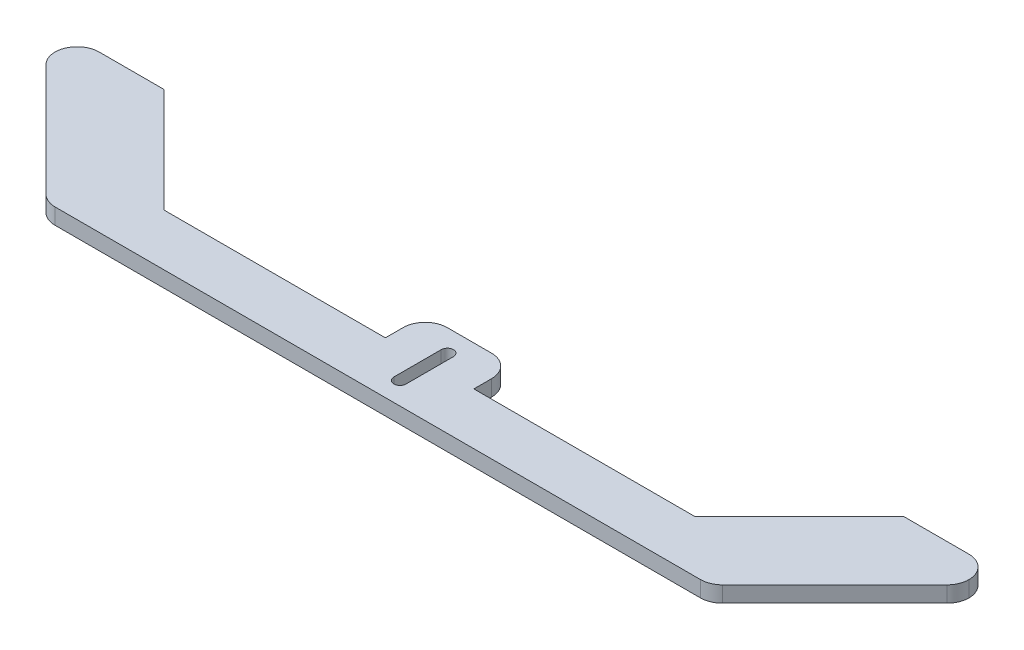
ISO-10303-21;
HEADER;
FILE_DESCRIPTION(('STEP AP214'),'2;1');
FILE_NAME('part.step','',(''),(''),'','','');
FILE_SCHEMA(('AUTOMOTIVE_DESIGN { 1 0 10303 214 1 1 1 1 }'));
ENDSEC;
DATA;
#1=APPLICATION_CONTEXT('core data for automotive mechanical design processes');
#2=APPLICATION_PROTOCOL_DEFINITION('international standard','automotive_design',2000,#1);
#3=PRODUCT_CONTEXT('',#1,'mechanical');
#4=PRODUCT('Part','Part','',(#3));
#5=PRODUCT_RELATED_PRODUCT_CATEGORY('part','',(#4));
#6=PRODUCT_DEFINITION_FORMATION('','',#4);
#7=PRODUCT_DEFINITION_CONTEXT('part definition',#1,'design');
#8=PRODUCT_DEFINITION('design','',#6,#7);
#9=PRODUCT_DEFINITION_SHAPE('','',#8);
#10=(LENGTH_UNIT() NAMED_UNIT(*) SI_UNIT(.MILLI.,.METRE.));
#11=(NAMED_UNIT(*) PLANE_ANGLE_UNIT() SI_UNIT($,.RADIAN.));
#12=(NAMED_UNIT(*) SI_UNIT($,.STERADIAN.) SOLID_ANGLE_UNIT());
#13=UNCERTAINTY_MEASURE_WITH_UNIT(LENGTH_MEASURE(1.E-05),#10,'distance_accuracy_value','');
#14=(GEOMETRIC_REPRESENTATION_CONTEXT(3) GLOBAL_UNCERTAINTY_ASSIGNED_CONTEXT((#13)) GLOBAL_UNIT_ASSIGNED_CONTEXT((#10,
#11,#12)) REPRESENTATION_CONTEXT('',''));
#15=CARTESIAN_POINT('',(0.,0.,0.));
#16=DIRECTION('',(0.,0.,1.));
#17=DIRECTION('',(1.,0.,0.));
#18=AXIS2_PLACEMENT_3D('',#15,#16,#17);
#19=CARTESIAN_POINT('',(0.,4.572,0.));
#20=DIRECTION('',(0.,-1.,0.));
#21=DIRECTION('',(0.,0.,-1.));
#22=AXIS2_PLACEMENT_3D('',#19,#20,#21);
#23=PLANE('',#22);
#24=DIRECTION('',(0.,0.,-1.));
#25=VECTOR('',#24,1.);
#26=CARTESIAN_POINT('',(15.4,4.572,-12.4016541141747));
#27=LINE('',#26,#25);
#28=CARTESIAN_POINT('',(15.4,4.572,-0.971654114174717));
#29=VERTEX_POINT('',#28);
#30=CARTESIAN_POINT('',(15.4,4.572,-6.05165411417471));
#31=VERTEX_POINT('',#30);
#32=EDGE_CURVE('E253',#29,#31,#27,.T.);
#33=ORIENTED_EDGE('',*,*,#32,.T.);
#34=CARTESIAN_POINT('',(9.05,4.572,-6.05165411417472));
#35=DIRECTION('',(0.,-1.,0.));
#36=DIRECTION('',(0.,0.,-1.));
#37=AXIS2_PLACEMENT_3D('',#34,#35,#36);
#38=CIRCLE('',#37,6.35);
#39=CARTESIAN_POINT('',(9.05,4.572,-12.4016541141747));
#40=VERTEX_POINT('',#39);
#41=EDGE_CURVE('E41',#31,#40,#38,.F.);
#42=ORIENTED_EDGE('',*,*,#41,.T.);
#43=DIRECTION('',(-1.,0.,0.));
#44=VECTOR('',#43,1.);
#45=CARTESIAN_POINT('',(15.4,4.572,-12.4016541141747));
#46=LINE('',#45,#44);
#47=CARTESIAN_POINT('',(-3.64999999999999,4.572,-12.4016541141747));
#48=VERTEX_POINT('',#47);
#49=EDGE_CURVE('E255',#40,#48,#46,.T.);
#50=ORIENTED_EDGE('',*,*,#49,.T.);
#51=CARTESIAN_POINT('',(-3.65,4.572,-6.05165411417472));
#52=DIRECTION('',(0.,-1.,0.));
#53=DIRECTION('',(0.,0.,-1.));
#54=AXIS2_PLACEMENT_3D('',#51,#52,#53);
#55=CIRCLE('',#54,6.35);
#56=CARTESIAN_POINT('',(-9.99999999999999,4.572,-6.05165411417472));
#57=VERTEX_POINT('',#56);
#58=EDGE_CURVE('E48',#48,#57,#55,.F.);
#59=ORIENTED_EDGE('',*,*,#58,.T.);
#60=DIRECTION('',(0.,0.,1.));
#61=VECTOR('',#60,1.);
#62=CARTESIAN_POINT('',(-9.99999999999999,4.572,-12.4016541141747));
#63=LINE('',#62,#61);
#64=CARTESIAN_POINT('',(-9.99999999999999,4.572,-0.971654114174714));
#65=VERTEX_POINT('',#64);
#66=EDGE_CURVE('E257',#57,#65,#63,.T.);
#67=ORIENTED_EDGE('',*,*,#66,.T.);
#68=DIRECTION('',(-1.,0.,0.));
#69=VECTOR('',#68,1.);
#70=CARTESIAN_POINT('',(-9.99999999999999,4.572,-0.971654114174714));
#71=LINE('',#70,#69);
#72=CARTESIAN_POINT('',(-73.5,4.572,-0.971654114174706));
#73=VERTEX_POINT('',#72);
#74=EDGE_CURVE('E259',#65,#73,#71,.T.);
#75=ORIENTED_EDGE('',*,*,#74,.T.);
#76=DIRECTION('',(-0.707106781186547,0.,-0.707106781186547));
#77=VECTOR('',#76,1.);
#78=CARTESIAN_POINT('',(-73.5,4.572,-0.971654114174706));
#79=LINE('',#78,#77);
#80=CARTESIAN_POINT('',(-103.478135759685,4.572,-30.94978987386));
#81=VERTEX_POINT('',#80);
#82=EDGE_CURVE('E261',#73,#81,#79,.T.);
#83=ORIENTED_EDGE('',*,*,#82,.T.);
#84=DIRECTION('',(-1.,0.,0.));
#85=VECTOR('',#84,1.);
#86=CARTESIAN_POINT('',(-103.478135759685,4.572,-30.94978987386));
#87=LINE('',#86,#85);
#88=CARTESIAN_POINT('',(-122.121024484277,4.572,-30.94978987386));
#89=VERTEX_POINT('',#88);
#90=EDGE_CURVE('E263',#81,#89,#87,.T.);
#91=ORIENTED_EDGE('',*,*,#90,.T.);
#92=CARTESIAN_POINT('',(-122.121024484277,4.572,-24.59978987386));
#93=DIRECTION('',(0.,-1.,0.));
#94=DIRECTION('',(0.,0.,-1.));
#95=AXIS2_PLACEMENT_3D('',#92,#93,#94);
#96=CIRCLE('',#95,6.35);
#97=CARTESIAN_POINT('',(-128.470968886108,4.572,-24.6263622966902));
#98=VERTEX_POINT('',#97);
#99=EDGE_CURVE('E339',#89,#98,#96,.F.);
#100=ORIENTED_EDGE('',*,*,#99,.T.);
#101=CARTESIAN_POINT('',(-122.121024484277,4.572,-24.6529347195205));
#102=DIRECTION('',(0.,-1.,0.));
#103=DIRECTION('',(0.,0.,-1.));
#104=AXIS2_PLACEMENT_3D('',#101,#102,#103);
#105=CIRCLE('',#104,6.35);
#106=CARTESIAN_POINT('',(-126.611152544811,4.572,-20.1628066589859));
#107=VERTEX_POINT('',#106);
#108=EDGE_CURVE('E337',#98,#107,#105,.F.);
#109=ORIENTED_EDGE('',*,*,#108,.T.);
#110=DIRECTION('',(0.707106781186548,0.,0.707106781186547));
#111=VECTOR('',#110,1.);
#112=CARTESIAN_POINT('',(-92.55,4.572,13.8983458858253));
#113=LINE('',#112,#111);
#114=CARTESIAN_POINT('',(-94.4098719394654,4.572,12.0384739463599));
#115=VERTEX_POINT('',#114);
#116=EDGE_CURVE('E266',#107,#115,#113,.T.);
#117=ORIENTED_EDGE('',*,*,#116,.T.);
#118=CARTESIAN_POINT('',(-89.9197438789308,4.572,7.54834588582531));
#119=DIRECTION('',(0.,-1.,0.));
#120=DIRECTION('',(0.,0.,-1.));
#121=AXIS2_PLACEMENT_3D('',#118,#119,#120);
#122=CIRCLE('',#121,6.35);
#123=CARTESIAN_POINT('',(-89.9197438789308,4.572,13.8983458858253));
#124=VERTEX_POINT('',#123);
#125=EDGE_CURVE('E329',#115,#124,#122,.F.);
#126=ORIENTED_EDGE('',*,*,#125,.T.);
#127=DIRECTION('',(1.,0.,0.));
#128=VECTOR('',#127,1.);
#129=CARTESIAN_POINT('',(15.4,4.572,13.8983458858253));
#130=LINE('',#129,#128);
#131=CARTESIAN_POINT('',(95.3197438789309,4.572,13.8983458858253));
#132=VERTEX_POINT('',#131);
#133=EDGE_CURVE('E240',#124,#132,#130,.T.);
#134=ORIENTED_EDGE('',*,*,#133,.T.);
#135=CARTESIAN_POINT('',(95.3197438789309,4.572,7.54834588582525));
#136=DIRECTION('',(0.,-1.,0.));
#137=DIRECTION('',(0.,0.,-1.));
#138=AXIS2_PLACEMENT_3D('',#135,#136,#137);
#139=CIRCLE('',#138,6.35);
#140=CARTESIAN_POINT('',(99.8098719394654,4.572,12.0384739463598));
#141=VERTEX_POINT('',#140);
#142=EDGE_CURVE('E331',#132,#141,#139,.F.);
#143=ORIENTED_EDGE('',*,*,#142,.T.);
#144=DIRECTION('',(0.707106781186548,0.,-0.707106781186547));
#145=VECTOR('',#144,1.);
#146=CARTESIAN_POINT('',(97.95,4.572,13.8983458858253));
#147=LINE('',#146,#145);
#148=CARTESIAN_POINT('',(132.011152544811,4.572,-20.1628066589859));
#149=VERTEX_POINT('',#148);
#150=EDGE_CURVE('E243',#141,#149,#147,.T.);
#151=ORIENTED_EDGE('',*,*,#150,.T.);
#152=CARTESIAN_POINT('',(127.521024484277,4.572,-24.6529347195205));
#153=DIRECTION('',(0.,-1.,0.));
#154=DIRECTION('',(0.,0.,-1.));
#155=AXIS2_PLACEMENT_3D('',#152,#153,#154);
#156=CIRCLE('',#155,6.35);
#157=CARTESIAN_POINT('',(133.870968886108,4.572,-24.6263622966903));
#158=VERTEX_POINT('',#157);
#159=EDGE_CURVE('E333',#149,#158,#156,.F.);
#160=ORIENTED_EDGE('',*,*,#159,.T.);
#161=CARTESIAN_POINT('',(127.521024484277,4.572,-24.59978987386));
#162=DIRECTION('',(0.,-1.,0.));
#163=DIRECTION('',(0.,0.,-1.));
#164=AXIS2_PLACEMENT_3D('',#161,#162,#163);
#165=CIRCLE('',#164,6.35);
#166=CARTESIAN_POINT('',(127.521024484277,4.572,-30.94978987386));
#167=VERTEX_POINT('',#166);
#168=EDGE_CURVE('E335',#158,#167,#165,.F.);
#169=ORIENTED_EDGE('',*,*,#168,.T.);
#170=DIRECTION('',(-1.,0.,0.));
#171=VECTOR('',#170,1.);
#172=CARTESIAN_POINT('',(108.878135759685,4.572,-30.94978987386));
#173=LINE('',#172,#171);
#174=CARTESIAN_POINT('',(108.878135759685,4.572,-30.94978987386));
#175=VERTEX_POINT('',#174);
#176=EDGE_CURVE('E247',#167,#175,#173,.T.);
#177=ORIENTED_EDGE('',*,*,#176,.T.);
#178=DIRECTION('',(-0.707106781186547,0.,0.707106781186548));
#179=VECTOR('',#178,1.);
#180=CARTESIAN_POINT('',(78.9,4.572,-0.971654114174717));
#181=LINE('',#180,#179);
#182=CARTESIAN_POINT('',(78.9,4.572,-0.971654114174717));
#183=VERTEX_POINT('',#182);
#184=EDGE_CURVE('E249',#175,#183,#181,.T.);
#185=ORIENTED_EDGE('',*,*,#184,.T.);
#186=DIRECTION('',(-1.,0.,0.));
#187=VECTOR('',#186,1.);
#188=CARTESIAN_POINT('',(15.4,4.572,-0.971654114174717));
#189=LINE('',#188,#187);
#190=EDGE_CURVE('E251',#183,#29,#189,.T.);
#191=ORIENTED_EDGE('',*,*,#190,.T.);
#192=EDGE_LOOP('',(#33,#42,#50,#59,#67,#75,#83,#91,#100,#109,#117,#126,#134,#143,#151,#160,#169,
#177,#185,#191));
#193=FACE_BOUND('',#192,.T.);
#194=CARTESIAN_POINT('',(2.7,4.572,7.54834588582528));
#195=DIRECTION('',(0.,1.,0.));
#196=DIRECTION('',(0.,0.,1.));
#197=AXIS2_PLACEMENT_3D('',#194,#195,#196);
#198=CIRCLE('',#197,1.75);
#199=CARTESIAN_POINT('',(0.949999999999996,4.572,7.54834588582528));
#200=VERTEX_POINT('',#199);
#201=CARTESIAN_POINT('',(4.45,4.572,7.54834588582528));
#202=VERTEX_POINT('',#201);
#203=EDGE_CURVE('E198',#200,#202,#198,.T.);
#204=ORIENTED_EDGE('',*,*,#203,.F.);
#205=DIRECTION('',(0.,0.,1.));
#206=VECTOR('',#205,1.);
#207=CARTESIAN_POINT('',(0.949999999999996,4.572,7.54834588582528));
#208=LINE('',#207,#206);
#209=CARTESIAN_POINT('',(0.949999999999995,4.572,-6.05165411417472));
#210=VERTEX_POINT('',#209);
#211=EDGE_CURVE('E223',#210,#200,#208,.T.);
#212=ORIENTED_EDGE('',*,*,#211,.F.);
#213=CARTESIAN_POINT('',(2.70000000000001,4.572,-6.05165411417472));
#214=DIRECTION('',(0.,1.,0.));
#215=DIRECTION('',(0.,0.,1.));
#216=AXIS2_PLACEMENT_3D('',#213,#214,#215);
#217=CIRCLE('',#216,1.75);
#218=CARTESIAN_POINT('',(4.45000000000001,4.572,-6.05165411417472));
#219=VERTEX_POINT('',#218);
#220=EDGE_CURVE('E221',#219,#210,#217,.T.);
#221=ORIENTED_EDGE('',*,*,#220,.F.);
#222=DIRECTION('',(0.,0.,-1.));
#223=VECTOR('',#222,1.);
#224=CARTESIAN_POINT('',(4.45,4.572,7.54834588582528));
#225=LINE('',#224,#223);
#226=EDGE_CURVE('E208',#202,#219,#225,.T.);
#227=ORIENTED_EDGE('',*,*,#226,.F.);
#228=EDGE_LOOP('',(#204,#212,#221,#227));
#229=FACE_BOUND('',#228,.T.);
#230=ADVANCED_FACE('F33',(#193,#229),#23,.F.);
#231=CARTESIAN_POINT('',(0.,0.,0.));
#232=DIRECTION('',(0.,-1.,0.));
#233=DIRECTION('',(0.,0.,-1.));
#234=AXIS2_PLACEMENT_3D('',#231,#232,#233);
#235=PLANE('',#234);
#236=DIRECTION('',(-1.,0.,0.));
#237=VECTOR('',#236,1.);
#238=CARTESIAN_POINT('',(15.4,0.,-12.4016541141747));
#239=LINE('',#238,#237);
#240=CARTESIAN_POINT('',(9.05,0.,-12.4016541141747));
#241=VERTEX_POINT('',#240);
#242=CARTESIAN_POINT('',(-3.64999999999999,0.,-12.4016541141747));
#243=VERTEX_POINT('',#242);
#244=EDGE_CURVE('E280',#241,#243,#239,.T.);
#245=ORIENTED_EDGE('',*,*,#244,.F.);
#246=CARTESIAN_POINT('',(9.05,0.,-6.05165411417472));
#247=DIRECTION('',(0.,-1.,0.));
#248=DIRECTION('',(0.,0.,-1.));
#249=AXIS2_PLACEMENT_3D('',#246,#247,#248);
#250=CIRCLE('',#249,6.35);
#251=CARTESIAN_POINT('',(15.4,0.,-6.05165411417471));
#252=VERTEX_POINT('',#251);
#253=EDGE_CURVE('E370',#241,#252,#250,.T.);
#254=ORIENTED_EDGE('',*,*,#253,.T.);
#255=DIRECTION('',(0.,0.,-1.));
#256=VECTOR('',#255,1.);
#257=CARTESIAN_POINT('',(15.4,0.,-12.4016541141747));
#258=LINE('',#257,#256);
#259=CARTESIAN_POINT('',(15.4,0.,-0.971654114174717));
#260=VERTEX_POINT('',#259);
#261=EDGE_CURVE('E278',#260,#252,#258,.T.);
#262=ORIENTED_EDGE('',*,*,#261,.F.);
#263=DIRECTION('',(-1.,0.,0.));
#264=VECTOR('',#263,1.);
#265=CARTESIAN_POINT('',(15.4,0.,-0.971654114174717));
#266=LINE('',#265,#264);
#267=CARTESIAN_POINT('',(78.9,0.,-0.971654114174717));
#268=VERTEX_POINT('',#267);
#269=EDGE_CURVE('E276',#268,#260,#266,.T.);
#270=ORIENTED_EDGE('',*,*,#269,.F.);
#271=DIRECTION('',(-0.707106781186547,0.,0.707106781186548));
#272=VECTOR('',#271,1.);
#273=CARTESIAN_POINT('',(78.9,0.,-0.971654114174717));
#274=LINE('',#273,#272);
#275=CARTESIAN_POINT('',(108.878135759685,0.,-30.94978987386));
#276=VERTEX_POINT('',#275);
#277=EDGE_CURVE('E274',#276,#268,#274,.T.);
#278=ORIENTED_EDGE('',*,*,#277,.F.);
#279=DIRECTION('',(-1.,0.,0.));
#280=VECTOR('',#279,1.);
#281=CARTESIAN_POINT('',(108.878135759685,0.,-30.94978987386));
#282=LINE('',#281,#280);
#283=CARTESIAN_POINT('',(127.521024484277,0.,-30.94978987386));
#284=VERTEX_POINT('',#283);
#285=EDGE_CURVE('E272',#284,#276,#282,.T.);
#286=ORIENTED_EDGE('',*,*,#285,.F.);
#287=CARTESIAN_POINT('',(127.521024484277,0.,-24.59978987386));
#288=DIRECTION('',(0.,-1.,0.));
#289=DIRECTION('',(0.,0.,-1.));
#290=AXIS2_PLACEMENT_3D('',#287,#288,#289);
#291=CIRCLE('',#290,6.35);
#292=CARTESIAN_POINT('',(133.870968886108,0.,-24.6263622966903));
#293=VERTEX_POINT('',#292);
#294=EDGE_CURVE('E323',#284,#293,#291,.T.);
#295=ORIENTED_EDGE('',*,*,#294,.T.);
#296=CARTESIAN_POINT('',(127.521024484277,0.,-24.6529347195205));
#297=DIRECTION('',(0.,-1.,0.));
#298=DIRECTION('',(0.,0.,-1.));
#299=AXIS2_PLACEMENT_3D('',#296,#297,#298);
#300=CIRCLE('',#299,6.35);
#301=CARTESIAN_POINT('',(132.011152544811,0.,-20.1628066589859));
#302=VERTEX_POINT('',#301);
#303=EDGE_CURVE('E321',#293,#302,#300,.T.);
#304=ORIENTED_EDGE('',*,*,#303,.T.);
#305=DIRECTION('',(0.707106781186548,0.,-0.707106781186547));
#306=VECTOR('',#305,1.);
#307=CARTESIAN_POINT('',(97.95,0.,13.8983458858253));
#308=LINE('',#307,#306);
#309=CARTESIAN_POINT('',(99.8098719394654,0.,12.0384739463598));
#310=VERTEX_POINT('',#309);
#311=EDGE_CURVE('E216',#310,#302,#308,.T.);
#312=ORIENTED_EDGE('',*,*,#311,.F.);
#313=CARTESIAN_POINT('',(95.3197438789309,0.,7.54834588582525));
#314=DIRECTION('',(0.,-1.,0.));
#315=DIRECTION('',(0.,0.,-1.));
#316=AXIS2_PLACEMENT_3D('',#313,#314,#315);
#317=CIRCLE('',#316,6.35);
#318=CARTESIAN_POINT('',(95.3197438789309,0.,13.8983458858252));
#319=VERTEX_POINT('',#318);
#320=EDGE_CURVE('E319',#310,#319,#317,.T.);
#321=ORIENTED_EDGE('',*,*,#320,.T.);
#322=DIRECTION('',(1.,0.,0.));
#323=VECTOR('',#322,1.);
#324=CARTESIAN_POINT('',(-10.,0.,13.8983458858253));
#325=LINE('',#324,#323);
#326=CARTESIAN_POINT('',(-89.9197438789308,0.,13.8983458858253));
#327=VERTEX_POINT('',#326);
#328=EDGE_CURVE('E244',#327,#319,#325,.T.);
#329=ORIENTED_EDGE('',*,*,#328,.F.);
#330=CARTESIAN_POINT('',(-89.9197438789308,0.,7.54834588582531));
#331=DIRECTION('',(0.,-1.,0.));
#332=DIRECTION('',(0.,0.,-1.));
#333=AXIS2_PLACEMENT_3D('',#330,#331,#332);
#334=CIRCLE('',#333,6.35);
#335=CARTESIAN_POINT('',(-94.4098719394654,0.,12.0384739463599));
#336=VERTEX_POINT('',#335);
#337=EDGE_CURVE('E317',#327,#336,#334,.T.);
#338=ORIENTED_EDGE('',*,*,#337,.T.);
#339=DIRECTION('',(0.707106781186548,0.,0.707106781186547));
#340=VECTOR('',#339,1.);
#341=CARTESIAN_POINT('',(-92.55,0.,13.8983458858253));
#342=LINE('',#341,#340);
#343=CARTESIAN_POINT('',(-126.611152544811,0.,-20.1628066589859));
#344=VERTEX_POINT('',#343);
#345=EDGE_CURVE('E292',#344,#336,#342,.T.);
#346=ORIENTED_EDGE('',*,*,#345,.F.);
#347=CARTESIAN_POINT('',(-122.121024484277,0.,-24.6529347195205));
#348=DIRECTION('',(0.,-1.,0.));
#349=DIRECTION('',(0.,0.,-1.));
#350=AXIS2_PLACEMENT_3D('',#347,#348,#349);
#351=CIRCLE('',#350,6.35);
#352=CARTESIAN_POINT('',(-128.470968886108,0.,-24.6263622966902));
#353=VERTEX_POINT('',#352);
#354=EDGE_CURVE('E325',#344,#353,#351,.T.);
#355=ORIENTED_EDGE('',*,*,#354,.T.);
#356=CARTESIAN_POINT('',(-122.121024484277,0.,-24.59978987386));
#357=DIRECTION('',(0.,-1.,0.));
#358=DIRECTION('',(0.,0.,-1.));
#359=AXIS2_PLACEMENT_3D('',#356,#357,#358);
#360=CIRCLE('',#359,6.35);
#361=CARTESIAN_POINT('',(-122.121024484277,0.,-30.94978987386));
#362=VERTEX_POINT('',#361);
#363=EDGE_CURVE('E327',#353,#362,#360,.T.);
#364=ORIENTED_EDGE('',*,*,#363,.T.);
#365=DIRECTION('',(-1.,0.,0.));
#366=VECTOR('',#365,1.);
#367=CARTESIAN_POINT('',(-103.478135759685,0.,-30.94978987386));
#368=LINE('',#367,#366);
#369=CARTESIAN_POINT('',(-103.478135759685,0.,-30.94978987386));
#370=VERTEX_POINT('',#369);
#371=EDGE_CURVE('E289',#370,#362,#368,.T.);
#372=ORIENTED_EDGE('',*,*,#371,.F.);
#373=DIRECTION('',(-0.707106781186547,0.,-0.707106781186547));
#374=VECTOR('',#373,1.);
#375=CARTESIAN_POINT('',(-73.5,0.,-0.971654114174706));
#376=LINE('',#375,#374);
#377=CARTESIAN_POINT('',(-73.5,0.,-0.971654114174706));
#378=VERTEX_POINT('',#377);
#379=EDGE_CURVE('E287',#378,#370,#376,.T.);
#380=ORIENTED_EDGE('',*,*,#379,.F.);
#381=DIRECTION('',(-1.,0.,0.));
#382=VECTOR('',#381,1.);
#383=CARTESIAN_POINT('',(-9.99999999999999,0.,-0.971654114174714));
#384=LINE('',#383,#382);
#385=CARTESIAN_POINT('',(-9.99999999999999,0.,-0.971654114174714));
#386=VERTEX_POINT('',#385);
#387=EDGE_CURVE('E285',#386,#378,#384,.T.);
#388=ORIENTED_EDGE('',*,*,#387,.F.);
#389=DIRECTION('',(0.,0.,1.));
#390=VECTOR('',#389,1.);
#391=CARTESIAN_POINT('',(-9.99999999999999,0.,-12.4016541141747));
#392=LINE('',#391,#390);
#393=CARTESIAN_POINT('',(-9.99999999999999,0.,-6.05165411417472));
#394=VERTEX_POINT('',#393);
#395=EDGE_CURVE('E283',#394,#386,#392,.T.);
#396=ORIENTED_EDGE('',*,*,#395,.F.);
#397=CARTESIAN_POINT('',(-3.65,0.,-6.05165411417472));
#398=DIRECTION('',(0.,-1.,0.));
#399=DIRECTION('',(0.,0.,-1.));
#400=AXIS2_PLACEMENT_3D('',#397,#398,#399);
#401=CIRCLE('',#400,6.35);
#402=EDGE_CURVE('E368',#394,#243,#401,.T.);
#403=ORIENTED_EDGE('',*,*,#402,.T.);
#404=EDGE_LOOP('',(#245,#254,#262,#270,#278,#286,#295,#304,#312,#321,#329,#338,#346,#355,#364,
#372,#380,#388,#396,#403));
#405=FACE_BOUND('',#404,.T.);
#406=DIRECTION('',(0.,0.,1.));
#407=VECTOR('',#406,1.);
#408=CARTESIAN_POINT('',(0.949999999999996,0.,7.54834588582528));
#409=LINE('',#408,#407);
#410=CARTESIAN_POINT('',(0.949999999999995,0.,-6.05165411417472));
#411=VERTEX_POINT('',#410);
#412=CARTESIAN_POINT('',(0.949999999999996,0.,7.54834588582528));
#413=VERTEX_POINT('',#412);
#414=EDGE_CURVE('E209',#411,#413,#409,.T.);
#415=ORIENTED_EDGE('',*,*,#414,.T.);
#416=CARTESIAN_POINT('',(2.7,0.,7.54834588582528));
#417=DIRECTION('',(0.,1.,0.));
#418=DIRECTION('',(0.,0.,1.));
#419=AXIS2_PLACEMENT_3D('',#416,#417,#418);
#420=CIRCLE('',#419,1.75);
#421=CARTESIAN_POINT('',(4.45,0.,7.54834588582528));
#422=VERTEX_POINT('',#421);
#423=EDGE_CURVE('E227',#413,#422,#420,.T.);
#424=ORIENTED_EDGE('',*,*,#423,.T.);
#425=DIRECTION('',(0.,0.,-1.));
#426=VECTOR('',#425,1.);
#427=CARTESIAN_POINT('',(4.45,0.,7.54834588582528));
#428=LINE('',#427,#426);
#429=CARTESIAN_POINT('',(4.45000000000001,0.,-6.05165411417472));
#430=VERTEX_POINT('',#429);
#431=EDGE_CURVE('E215',#422,#430,#428,.T.);
#432=ORIENTED_EDGE('',*,*,#431,.T.);
#433=CARTESIAN_POINT('',(2.70000000000001,0.,-6.05165411417472));
#434=DIRECTION('',(0.,1.,0.));
#435=DIRECTION('',(0.,0.,1.));
#436=AXIS2_PLACEMENT_3D('',#433,#434,#435);
#437=CIRCLE('',#436,1.75);
#438=EDGE_CURVE('E231',#430,#411,#437,.T.);
#439=ORIENTED_EDGE('',*,*,#438,.T.);
#440=EDGE_LOOP('',(#415,#424,#432,#439));
#441=FACE_BOUND('',#440,.T.);
#442=ADVANCED_FACE('F384',(#405,#441),#235,.T.);
#443=CARTESIAN_POINT('',(97.95,4.572,13.8983458858253));
#444=DIRECTION('',(-0.707106781186547,0.,-0.707106781186548));
#445=DIRECTION('',(-0.707106781186548,0.,0.707106781186547));
#446=AXIS2_PLACEMENT_3D('',#443,#444,#445);
#447=PLANE('',#446);
#448=ORIENTED_EDGE('',*,*,#311,.T.);
#449=DIRECTION('',(0.,-1.,0.));
#450=VECTOR('',#449,1.);
#451=CARTESIAN_POINT('',(132.011152544811,4.572,-20.1628066589859));
#452=LINE('',#451,#450);
#453=EDGE_CURVE('E351',#302,#149,#452,.F.);
#454=ORIENTED_EDGE('',*,*,#453,.T.);
#455=ORIENTED_EDGE('',*,*,#150,.F.);
#456=DIRECTION('',(0.,-1.,0.));
#457=VECTOR('',#456,1.);
#458=CARTESIAN_POINT('',(99.8098719394654,4.572,12.0384739463598));
#459=LINE('',#458,#457);
#460=EDGE_CURVE('E348',#141,#310,#459,.T.);
#461=ORIENTED_EDGE('',*,*,#460,.T.);
#462=EDGE_LOOP('',(#448,#454,#455,#461));
#463=FACE_BOUND('',#462,.T.);
#464=ADVANCED_FACE('F415',(#463),#447,.F.);
#465=CARTESIAN_POINT('',(108.878135759685,4.572,-30.94978987386));
#466=DIRECTION('',(0.,0.,1.));
#467=DIRECTION('',(1.,0.,0.));
#468=AXIS2_PLACEMENT_3D('',#465,#466,#467);
#469=PLANE('',#468);
#470=ORIENTED_EDGE('',*,*,#176,.F.);
#471=DIRECTION('',(0.,-1.,0.));
#472=VECTOR('',#471,1.);
#473=CARTESIAN_POINT('',(127.521024484277,4.572,-30.94978987386));
#474=LINE('',#473,#472);
#475=EDGE_CURVE('E314',#167,#284,#474,.T.);
#476=ORIENTED_EDGE('',*,*,#475,.T.);
#477=ORIENTED_EDGE('',*,*,#285,.T.);
#478=DIRECTION('',(0.,-1.,0.));
#479=VECTOR('',#478,1.);
#480=CARTESIAN_POINT('',(108.878135759685,4.572,-30.94978987386));
#481=LINE('',#480,#479);
#482=EDGE_CURVE('E311',#175,#276,#481,.T.);
#483=ORIENTED_EDGE('',*,*,#482,.F.);
#484=EDGE_LOOP('',(#470,#476,#477,#483));
#485=FACE_BOUND('',#484,.T.);
#486=ADVANCED_FACE('F401',(#485),#469,.F.);
#487=CARTESIAN_POINT('',(78.9,4.572,-0.971654114174717));
#488=DIRECTION('',(0.707106781186548,0.,0.707106781186547));
#489=DIRECTION('',(0.707106781186547,0.,-0.707106781186548));
#490=AXIS2_PLACEMENT_3D('',#487,#488,#489);
#491=PLANE('',#490);
#492=ORIENTED_EDGE('',*,*,#277,.T.);
#493=DIRECTION('',(0.,-1.,0.));
#494=VECTOR('',#493,1.);
#495=CARTESIAN_POINT('',(78.9,4.572,-0.971654114174717));
#496=LINE('',#495,#494);
#497=EDGE_CURVE('E308',#183,#268,#496,.T.);
#498=ORIENTED_EDGE('',*,*,#497,.F.);
#499=ORIENTED_EDGE('',*,*,#184,.F.);
#500=ORIENTED_EDGE('',*,*,#482,.T.);
#501=EDGE_LOOP('',(#492,#498,#499,#500));
#502=FACE_BOUND('',#501,.T.);
#503=ADVANCED_FACE('F396',(#502),#491,.F.);
#504=CARTESIAN_POINT('',(15.4,4.572,-0.971654114174717));
#505=DIRECTION('',(0.,0.,1.));
#506=DIRECTION('',(1.,0.,0.));
#507=AXIS2_PLACEMENT_3D('',#504,#505,#506);
#508=PLANE('',#507);
#509=ORIENTED_EDGE('',*,*,#269,.T.);
#510=DIRECTION('',(0.,-1.,0.));
#511=VECTOR('',#510,1.);
#512=CARTESIAN_POINT('',(15.4,4.572,-0.971654114174717));
#513=LINE('',#512,#511);
#514=EDGE_CURVE('E305',#29,#260,#513,.T.);
#515=ORIENTED_EDGE('',*,*,#514,.F.);
#516=ORIENTED_EDGE('',*,*,#190,.F.);
#517=ORIENTED_EDGE('',*,*,#497,.T.);
#518=EDGE_LOOP('',(#509,#515,#516,#517));
#519=FACE_BOUND('',#518,.T.);
#520=ADVANCED_FACE('F391',(#519),#508,.F.);
#521=CARTESIAN_POINT('',(15.4,4.572,-12.4016541141747));
#522=DIRECTION('',(-1.,0.,0.));
#523=DIRECTION('',(0.,0.,1.));
#524=AXIS2_PLACEMENT_3D('',#521,#522,#523);
#525=PLANE('',#524);
#526=ORIENTED_EDGE('',*,*,#261,.T.);
#527=DIRECTION('',(0.,-1.,0.));
#528=VECTOR('',#527,1.);
#529=CARTESIAN_POINT('',(15.4,4.572,-6.05165411417471));
#530=LINE('',#529,#528);
#531=EDGE_CURVE('E56',#252,#31,#530,.F.);
#532=ORIENTED_EDGE('',*,*,#531,.T.);
#533=ORIENTED_EDGE('',*,*,#32,.F.);
#534=ORIENTED_EDGE('',*,*,#514,.T.);
#535=EDGE_LOOP('',(#526,#532,#533,#534));
#536=FACE_BOUND('',#535,.T.);
#537=ADVANCED_FACE('F387',(#536),#525,.F.);
#538=CARTESIAN_POINT('',(15.4,4.572,-12.4016541141747));
#539=DIRECTION('',(0.,0.,1.));
#540=DIRECTION('',(1.,0.,0.));
#541=AXIS2_PLACEMENT_3D('',#538,#539,#540);
#542=PLANE('',#541);
#543=ORIENTED_EDGE('',*,*,#49,.F.);
#544=DIRECTION('',(0.,-1.,0.));
#545=VECTOR('',#544,1.);
#546=CARTESIAN_POINT('',(9.05,4.572,-12.4016541141747));
#547=LINE('',#546,#545);
#548=EDGE_CURVE('E365',#40,#241,#547,.T.);
#549=ORIENTED_EDGE('',*,*,#548,.T.);
#550=ORIENTED_EDGE('',*,*,#244,.T.);
#551=DIRECTION('',(0.,-1.,0.));
#552=VECTOR('',#551,1.);
#553=CARTESIAN_POINT('',(-3.65,4.572,-12.4016541141747));
#554=LINE('',#553,#552);
#555=EDGE_CURVE('E358',#243,#48,#554,.F.);
#556=ORIENTED_EDGE('',*,*,#555,.T.);
#557=EDGE_LOOP('',(#543,#549,#550,#556));
#558=FACE_BOUND('',#557,.T.);
#559=ADVANCED_FACE('F378',(#558),#542,.F.);
#560=CARTESIAN_POINT('',(-9.99999999999999,4.572,-12.4016541141747));
#561=DIRECTION('',(1.,0.,0.));
#562=DIRECTION('',(0.,0.,-1.));
#563=AXIS2_PLACEMENT_3D('',#560,#561,#562);
#564=PLANE('',#563);
#565=ORIENTED_EDGE('',*,*,#66,.F.);
#566=DIRECTION('',(0.,-1.,0.));
#567=VECTOR('',#566,1.);
#568=CARTESIAN_POINT('',(-9.99999999999999,4.572,-6.05165411417472));
#569=LINE('',#568,#567);
#570=EDGE_CURVE('E11',#57,#394,#569,.T.);
#571=ORIENTED_EDGE('',*,*,#570,.T.);
#572=ORIENTED_EDGE('',*,*,#395,.T.);
#573=DIRECTION('',(0.,-1.,0.));
#574=VECTOR('',#573,1.);
#575=CARTESIAN_POINT('',(-9.99999999999999,4.572,-0.971654114174714));
#576=LINE('',#575,#574);
#577=EDGE_CURVE('E302',#65,#386,#576,.T.);
#578=ORIENTED_EDGE('',*,*,#577,.F.);
#579=EDGE_LOOP('',(#565,#571,#572,#578));
#580=FACE_BOUND('',#579,.T.);
#581=ADVANCED_FACE('F461',(#580),#564,.F.);
#582=CARTESIAN_POINT('',(-9.99999999999999,4.572,-0.971654114174714));
#583=DIRECTION('',(0.,0.,1.));
#584=DIRECTION('',(1.,0.,0.));
#585=AXIS2_PLACEMENT_3D('',#582,#583,#584);
#586=PLANE('',#585);
#587=ORIENTED_EDGE('',*,*,#387,.T.);
#588=DIRECTION('',(0.,-1.,0.));
#589=VECTOR('',#588,1.);
#590=CARTESIAN_POINT('',(-73.5,4.572,-0.971654114174706));
#591=LINE('',#590,#589);
#592=EDGE_CURVE('E299',#73,#378,#591,.T.);
#593=ORIENTED_EDGE('',*,*,#592,.F.);
#594=ORIENTED_EDGE('',*,*,#74,.F.);
#595=ORIENTED_EDGE('',*,*,#577,.T.);
#596=EDGE_LOOP('',(#587,#593,#594,#595));
#597=FACE_BOUND('',#596,.T.);
#598=ADVANCED_FACE('F458',(#597),#586,.F.);
#599=CARTESIAN_POINT('',(-73.5,4.572,-0.971654114174706));
#600=DIRECTION('',(-0.707106781186548,0.,0.707106781186548));
#601=DIRECTION('',(0.707106781186548,0.,0.707106781186548));
#602=AXIS2_PLACEMENT_3D('',#599,#600,#601);
#603=PLANE('',#602);
#604=ORIENTED_EDGE('',*,*,#379,.T.);
#605=DIRECTION('',(0.,-1.,0.));
#606=VECTOR('',#605,1.);
#607=CARTESIAN_POINT('',(-103.478135759685,4.572,-30.94978987386));
#608=LINE('',#607,#606);
#609=EDGE_CURVE('E269',#81,#370,#608,.T.);
#610=ORIENTED_EDGE('',*,*,#609,.F.);
#611=ORIENTED_EDGE('',*,*,#82,.F.);
#612=ORIENTED_EDGE('',*,*,#592,.T.);
#613=EDGE_LOOP('',(#604,#610,#611,#612));
#614=FACE_BOUND('',#613,.T.);
#615=ADVANCED_FACE('F454',(#614),#603,.F.);
#616=CARTESIAN_POINT('',(-103.478135759685,4.572,-30.94978987386));
#617=DIRECTION('',(0.,0.,1.));
#618=DIRECTION('',(1.,0.,0.));
#619=AXIS2_PLACEMENT_3D('',#616,#617,#618);
#620=PLANE('',#619);
#621=ORIENTED_EDGE('',*,*,#371,.T.);
#622=DIRECTION('',(0.,-1.,0.));
#623=VECTOR('',#622,1.);
#624=CARTESIAN_POINT('',(-122.121024484277,4.572,-30.94978987386));
#625=LINE('',#624,#623);
#626=EDGE_CURVE('E341',#362,#89,#625,.F.);
#627=ORIENTED_EDGE('',*,*,#626,.T.);
#628=ORIENTED_EDGE('',*,*,#90,.F.);
#629=ORIENTED_EDGE('',*,*,#609,.T.);
#630=EDGE_LOOP('',(#621,#627,#628,#629));
#631=FACE_BOUND('',#630,.T.);
#632=ADVANCED_FACE('F446',(#631),#620,.F.);
#633=CARTESIAN_POINT('',(-92.55,4.572,13.8983458858253));
#634=DIRECTION('',(0.707106781186547,0.,-0.707106781186548));
#635=DIRECTION('',(-0.707106781186548,0.,-0.707106781186547));
#636=AXIS2_PLACEMENT_3D('',#633,#634,#635);
#637=PLANE('',#636);
#638=ORIENTED_EDGE('',*,*,#116,.F.);
#639=DIRECTION('',(0.,-1.,0.));
#640=VECTOR('',#639,1.);
#641=CARTESIAN_POINT('',(-126.611152544811,4.572,-20.1628066589859));
#642=LINE('',#641,#640);
#643=EDGE_CURVE('E346',#107,#344,#642,.T.);
#644=ORIENTED_EDGE('',*,*,#643,.T.);
#645=ORIENTED_EDGE('',*,*,#345,.T.);
#646=DIRECTION('',(0.,-1.,0.));
#647=VECTOR('',#646,1.);
#648=CARTESIAN_POINT('',(-94.4098719394654,4.572,12.0384739463599));
#649=LINE('',#648,#647);
#650=EDGE_CURVE('E344',#336,#115,#649,.F.);
#651=ORIENTED_EDGE('',*,*,#650,.T.);
#652=EDGE_LOOP('',(#638,#644,#645,#651));
#653=FACE_BOUND('',#652,.T.);
#654=ADVANCED_FACE('F434',(#653),#637,.F.);
#655=CARTESIAN_POINT('',(-10.,4.572,13.8983458858253));
#656=DIRECTION('',(0.,0.,-1.));
#657=DIRECTION('',(-1.,0.,0.));
#658=AXIS2_PLACEMENT_3D('',#655,#656,#657);
#659=PLANE('',#658);
#660=ORIENTED_EDGE('',*,*,#328,.T.);
#661=DIRECTION('',(0.,-1.,0.));
#662=VECTOR('',#661,1.);
#663=CARTESIAN_POINT('',(95.3197438789309,4.572,13.8983458858252));
#664=LINE('',#663,#662);
#665=EDGE_CURVE('E356',#319,#132,#664,.F.);
#666=ORIENTED_EDGE('',*,*,#665,.T.);
#667=ORIENTED_EDGE('',*,*,#133,.F.);
#668=DIRECTION('',(0.,-1.,0.));
#669=VECTOR('',#668,1.);
#670=CARTESIAN_POINT('',(-89.9197438789308,4.572,13.8983458858253));
#671=LINE('',#670,#669);
#672=EDGE_CURVE('E353',#124,#327,#671,.T.);
#673=ORIENTED_EDGE('',*,*,#672,.T.);
#674=EDGE_LOOP('',(#660,#666,#667,#673));
#675=FACE_BOUND('',#674,.T.);
#676=ADVANCED_FACE('F424',(#675),#659,.F.);
#677=CARTESIAN_POINT('',(2.7,4.572,7.54834588582528));
#678=DIRECTION('',(0.,-1.,0.));
#679=DIRECTION('',(0.,0.,-1.));
#680=AXIS2_PLACEMENT_3D('',#677,#678,#679);
#681=CYLINDRICAL_SURFACE('',#680,1.75);
#682=ORIENTED_EDGE('',*,*,#423,.F.);
#683=DIRECTION('',(0.,-1.,0.));
#684=VECTOR('',#683,1.);
#685=CARTESIAN_POINT('',(0.949999999999996,4.572,7.54834588582528));
#686=LINE('',#685,#684);
#687=EDGE_CURVE('E204',#200,#413,#686,.T.);
#688=ORIENTED_EDGE('',*,*,#687,.F.);
#689=ORIENTED_EDGE('',*,*,#203,.T.);
#690=DIRECTION('',(0.,-1.,0.));
#691=VECTOR('',#690,1.);
#692=CARTESIAN_POINT('',(4.45,4.572,7.54834588582528));
#693=LINE('',#692,#691);
#694=EDGE_CURVE('E201',#202,#422,#693,.T.);
#695=ORIENTED_EDGE('',*,*,#694,.T.);
#696=EDGE_LOOP('',(#682,#688,#689,#695));
#697=FACE_BOUND('',#696,.T.);
#698=ADVANCED_FACE('F200',(#697),#681,.F.);
#699=CARTESIAN_POINT('',(4.45,4.572,7.54834588582528));
#700=DIRECTION('',(-1.,0.,0.));
#701=DIRECTION('',(0.,0.,1.));
#702=AXIS2_PLACEMENT_3D('',#699,#700,#701);
#703=PLANE('',#702);
#704=ORIENTED_EDGE('',*,*,#431,.F.);
#705=ORIENTED_EDGE('',*,*,#694,.F.);
#706=ORIENTED_EDGE('',*,*,#226,.T.);
#707=DIRECTION('',(0.,-1.,0.));
#708=VECTOR('',#707,1.);
#709=CARTESIAN_POINT('',(4.45000000000001,4.572,-6.05165411417472));
#710=LINE('',#709,#708);
#711=EDGE_CURVE('E217',#219,#430,#710,.T.);
#712=ORIENTED_EDGE('',*,*,#711,.T.);
#713=EDGE_LOOP('',(#704,#705,#706,#712));
#714=FACE_BOUND('',#713,.T.);
#715=ADVANCED_FACE('F212',(#714),#703,.T.);
#716=CARTESIAN_POINT('',(2.70000000000001,4.572,-6.05165411417472));
#717=DIRECTION('',(0.,-1.,0.));
#718=DIRECTION('',(0.,0.,-1.));
#719=AXIS2_PLACEMENT_3D('',#716,#717,#718);
#720=CYLINDRICAL_SURFACE('',#719,1.75);
#721=ORIENTED_EDGE('',*,*,#438,.F.);
#722=ORIENTED_EDGE('',*,*,#711,.F.);
#723=ORIENTED_EDGE('',*,*,#220,.T.);
#724=DIRECTION('',(0.,-1.,0.));
#725=VECTOR('',#724,1.);
#726=CARTESIAN_POINT('',(0.949999999999995,4.572,-6.05165411417472));
#727=LINE('',#726,#725);
#728=EDGE_CURVE('E237',#210,#411,#727,.T.);
#729=ORIENTED_EDGE('',*,*,#728,.T.);
#730=EDGE_LOOP('',(#721,#722,#723,#729));
#731=FACE_BOUND('',#730,.T.);
#732=ADVANCED_FACE('F603',(#731),#720,.F.);
#733=CARTESIAN_POINT('',(0.949999999999996,4.572,7.54834588582528));
#734=DIRECTION('',(1.,0.,0.));
#735=DIRECTION('',(0.,0.,-1.));
#736=AXIS2_PLACEMENT_3D('',#733,#734,#735);
#737=PLANE('',#736);
#738=ORIENTED_EDGE('',*,*,#414,.F.);
#739=ORIENTED_EDGE('',*,*,#728,.F.);
#740=ORIENTED_EDGE('',*,*,#211,.T.);
#741=ORIENTED_EDGE('',*,*,#687,.T.);
#742=EDGE_LOOP('',(#738,#739,#740,#741));
#743=FACE_BOUND('',#742,.T.);
#744=ADVANCED_FACE('F505',(#743),#737,.T.);
#745=CARTESIAN_POINT('',(127.521024484277,4.572,-24.6529347195205));
#746=DIRECTION('',(0.,-1.,0.));
#747=DIRECTION('',(0.,0.,-1.));
#748=AXIS2_PLACEMENT_3D('',#745,#746,#747);
#749=CYLINDRICAL_SURFACE('',#748,6.35);
#750=DIRECTION('',(0.,-1.,0.));
#751=VECTOR('',#750,1.);
#752=CARTESIAN_POINT('',(133.870968886108,2.286,-24.6263622966903));
#753=LINE('',#752,#751);
#754=EDGE_CURVE('E229',#158,#293,#753,.T.);
#755=ORIENTED_EDGE('',*,*,#754,.F.);
#756=ORIENTED_EDGE('',*,*,#159,.F.);
#757=ORIENTED_EDGE('',*,*,#453,.F.);
#758=ORIENTED_EDGE('',*,*,#303,.F.);
#759=EDGE_LOOP('',(#755,#756,#757,#758));
#760=FACE_BOUND('',#759,.T.);
#761=ADVANCED_FACE('F411',(#760),#749,.T.);
#762=CARTESIAN_POINT('',(127.521024484277,4.572,-24.59978987386));
#763=DIRECTION('',(0.,-1.,0.));
#764=DIRECTION('',(0.,0.,-1.));
#765=AXIS2_PLACEMENT_3D('',#762,#763,#764);
#766=CYLINDRICAL_SURFACE('',#765,6.35);
#767=ORIENTED_EDGE('',*,*,#168,.F.);
#768=ORIENTED_EDGE('',*,*,#754,.T.);
#769=ORIENTED_EDGE('',*,*,#294,.F.);
#770=ORIENTED_EDGE('',*,*,#475,.F.);
#771=EDGE_LOOP('',(#767,#768,#769,#770));
#772=FACE_BOUND('',#771,.T.);
#773=ADVANCED_FACE('F405',(#772),#766,.T.);
#774=CARTESIAN_POINT('',(-122.121024484277,4.572,-24.6529347195205));
#775=DIRECTION('',(0.,-1.,0.));
#776=DIRECTION('',(0.,0.,-1.));
#777=AXIS2_PLACEMENT_3D('',#774,#775,#776);
#778=CYLINDRICAL_SURFACE('',#777,6.35);
#779=ORIENTED_EDGE('',*,*,#643,.F.);
#780=ORIENTED_EDGE('',*,*,#108,.F.);
#781=DIRECTION('',(0.,-1.,0.));
#782=VECTOR('',#781,1.);
#783=CARTESIAN_POINT('',(-128.470968886108,2.286,-24.6263622966902));
#784=LINE('',#783,#782);
#785=EDGE_CURVE('E361',#353,#98,#784,.F.);
#786=ORIENTED_EDGE('',*,*,#785,.F.);
#787=ORIENTED_EDGE('',*,*,#354,.F.);
#788=EDGE_LOOP('',(#779,#780,#786,#787));
#789=FACE_BOUND('',#788,.T.);
#790=ADVANCED_FACE('F438',(#789),#778,.T.);
#791=CARTESIAN_POINT('',(-122.121024484277,4.572,-24.59978987386));
#792=DIRECTION('',(0.,-1.,0.));
#793=DIRECTION('',(0.,0.,-1.));
#794=AXIS2_PLACEMENT_3D('',#791,#792,#793);
#795=CYLINDRICAL_SURFACE('',#794,6.35);
#796=ORIENTED_EDGE('',*,*,#99,.F.);
#797=ORIENTED_EDGE('',*,*,#626,.F.);
#798=ORIENTED_EDGE('',*,*,#363,.F.);
#799=ORIENTED_EDGE('',*,*,#785,.T.);
#800=EDGE_LOOP('',(#796,#797,#798,#799));
#801=FACE_BOUND('',#800,.T.);
#802=ADVANCED_FACE('F449',(#801),#795,.T.);
#803=CARTESIAN_POINT('',(95.3197438789309,4.572,7.54834588582525));
#804=DIRECTION('',(0.,-1.,0.));
#805=DIRECTION('',(0.,0.,-1.));
#806=AXIS2_PLACEMENT_3D('',#803,#804,#805);
#807=CYLINDRICAL_SURFACE('',#806,6.35);
#808=ORIENTED_EDGE('',*,*,#142,.F.);
#809=ORIENTED_EDGE('',*,*,#665,.F.);
#810=ORIENTED_EDGE('',*,*,#320,.F.);
#811=ORIENTED_EDGE('',*,*,#460,.F.);
#812=EDGE_LOOP('',(#808,#809,#810,#811));
#813=FACE_BOUND('',#812,.T.);
#814=ADVANCED_FACE('F421',(#813),#807,.T.);
#815=CARTESIAN_POINT('',(-89.9197438789308,4.572,7.54834588582531));
#816=DIRECTION('',(0.,-1.,0.));
#817=DIRECTION('',(0.,0.,-1.));
#818=AXIS2_PLACEMENT_3D('',#815,#816,#817);
#819=CYLINDRICAL_SURFACE('',#818,6.35);
#820=ORIENTED_EDGE('',*,*,#125,.F.);
#821=ORIENTED_EDGE('',*,*,#650,.F.);
#822=ORIENTED_EDGE('',*,*,#337,.F.);
#823=ORIENTED_EDGE('',*,*,#672,.F.);
#824=EDGE_LOOP('',(#820,#821,#822,#823));
#825=FACE_BOUND('',#824,.T.);
#826=ADVANCED_FACE('F428',(#825),#819,.T.);
#827=CARTESIAN_POINT('',(9.05,4.572,-6.05165411417472));
#828=DIRECTION('',(0.,-1.,0.));
#829=DIRECTION('',(0.,0.,-1.));
#830=AXIS2_PLACEMENT_3D('',#827,#828,#829);
#831=CYLINDRICAL_SURFACE('',#830,6.35);
#832=ORIENTED_EDGE('',*,*,#41,.F.);
#833=ORIENTED_EDGE('',*,*,#531,.F.);
#834=ORIENTED_EDGE('',*,*,#253,.F.);
#835=ORIENTED_EDGE('',*,*,#548,.F.);
#836=EDGE_LOOP('',(#832,#833,#834,#835));
#837=FACE_BOUND('',#836,.T.);
#838=ADVANCED_FACE('F381',(#837),#831,.T.);
#839=CARTESIAN_POINT('',(-3.65,4.572,-6.05165411417472));
#840=DIRECTION('',(0.,-1.,0.));
#841=DIRECTION('',(0.,0.,-1.));
#842=AXIS2_PLACEMENT_3D('',#839,#840,#841);
#843=CYLINDRICAL_SURFACE('',#842,6.35);
#844=ORIENTED_EDGE('',*,*,#58,.F.);
#845=ORIENTED_EDGE('',*,*,#555,.F.);
#846=ORIENTED_EDGE('',*,*,#402,.F.);
#847=ORIENTED_EDGE('',*,*,#570,.F.);
#848=EDGE_LOOP('',(#844,#845,#846,#847));
#849=FACE_BOUND('',#848,.T.);
#850=ADVANCED_FACE('F35',(#849),#843,.T.);
#851=CLOSED_SHELL('',(#230,#442,#464,#486,#503,#520,#537,#559,#581,#598,#615,#632,#654,#676,
#698,#715,#732,#744,#761,#773,#790,#802,#814,#826,#838,#850));
#852=MANIFOLD_SOLID_BREP('B2',#851);
#853=ADVANCED_BREP_SHAPE_REPRESENTATION('',(#18,#852),#14);
#854=SHAPE_DEFINITION_REPRESENTATION(#9,#853);
ENDSEC;
END-ISO-10303-21;
